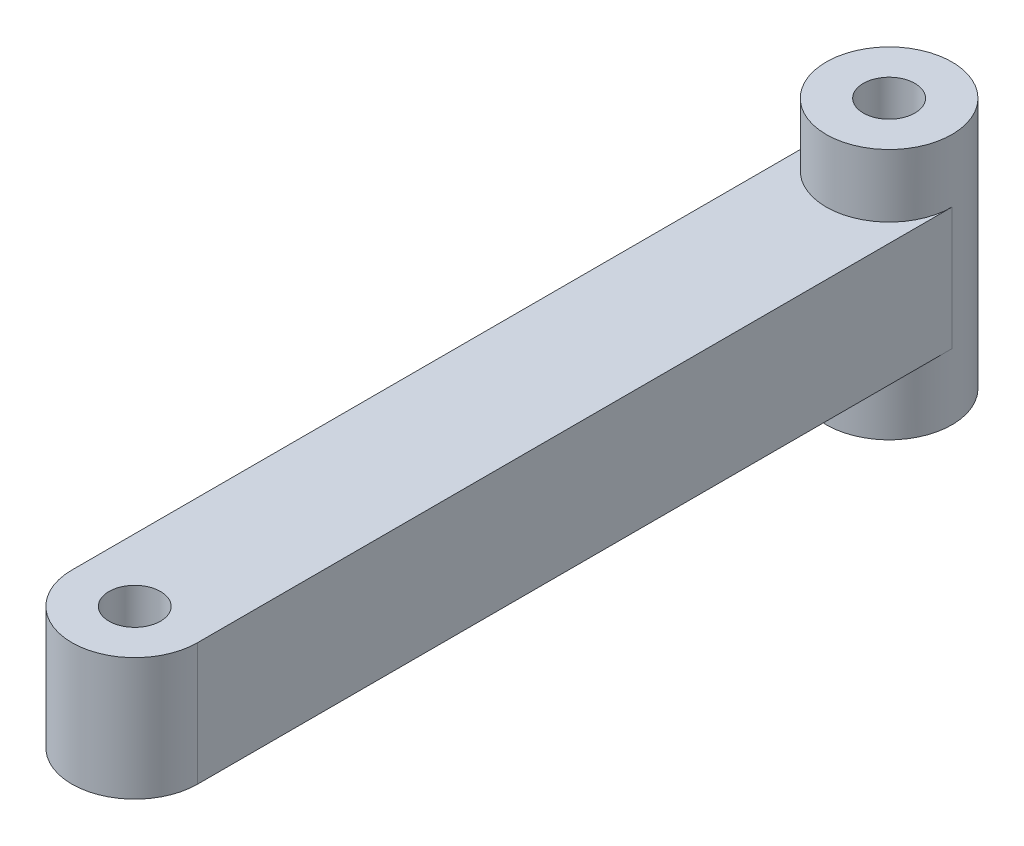
ISO-10303-21;
HEADER;
FILE_DESCRIPTION(('STEP AP214'),'2;1');
FILE_NAME('part.step','',(''),(''),'','','');
FILE_SCHEMA(('AUTOMOTIVE_DESIGN { 1 0 10303 214 1 1 1 1 }'));
ENDSEC;
DATA;
#1=APPLICATION_CONTEXT('core data for automotive mechanical design processes');
#2=APPLICATION_PROTOCOL_DEFINITION('international standard','automotive_design',2000,#1);
#3=PRODUCT_CONTEXT('',#1,'mechanical');
#4=PRODUCT('Part','Part','',(#3));
#5=PRODUCT_RELATED_PRODUCT_CATEGORY('part','',(#4));
#6=PRODUCT_DEFINITION_FORMATION('','',#4);
#7=PRODUCT_DEFINITION_CONTEXT('part definition',#1,'design');
#8=PRODUCT_DEFINITION('design','',#6,#7);
#9=PRODUCT_DEFINITION_SHAPE('','',#8);
#10=(LENGTH_UNIT() NAMED_UNIT(*) SI_UNIT(.MILLI.,.METRE.));
#11=(NAMED_UNIT(*) PLANE_ANGLE_UNIT() SI_UNIT($,.RADIAN.));
#12=(NAMED_UNIT(*) SI_UNIT($,.STERADIAN.) SOLID_ANGLE_UNIT());
#13=UNCERTAINTY_MEASURE_WITH_UNIT(LENGTH_MEASURE(1.E-05),#10,'distance_accuracy_value','');
#14=(GEOMETRIC_REPRESENTATION_CONTEXT(3) GLOBAL_UNCERTAINTY_ASSIGNED_CONTEXT((#13)) GLOBAL_UNIT_ASSIGNED_CONTEXT((#10,
#11,#12)) REPRESENTATION_CONTEXT('',''));
#15=CARTESIAN_POINT('',(0.,0.,0.));
#16=DIRECTION('',(0.,0.,1.));
#17=DIRECTION('',(1.,0.,0.));
#18=AXIS2_PLACEMENT_3D('',#15,#16,#17);
#19=CARTESIAN_POINT('',(0.,9.75,0.));
#20=DIRECTION('',(0.,1.,0.));
#21=DIRECTION('',(0.,0.,1.));
#22=AXIS2_PLACEMENT_3D('',#19,#20,#21);
#23=PLANE('',#22);
#24=CARTESIAN_POINT('',(0.,9.75,-60.));
#25=DIRECTION('',(0.,1.,0.));
#26=DIRECTION('',(0.,0.,1.));
#27=AXIS2_PLACEMENT_3D('',#24,#25,#26);
#28=CIRCLE('',#27,5.);
#29=CARTESIAN_POINT('',(-5.,9.75,-60.));
#30=VERTEX_POINT('',#29);
#31=CARTESIAN_POINT('',(5.,9.75,-60.));
#32=VERTEX_POINT('',#31);
#33=EDGE_CURVE('E94',#30,#32,#28,.T.);
#34=ORIENTED_EDGE('',*,*,#33,.F.);
#35=DIRECTION('',(0.,0.,1.));
#36=VECTOR('',#35,1.);
#37=CARTESIAN_POINT('',(-5.,9.75,0.));
#38=LINE('',#37,#36);
#39=CARTESIAN_POINT('',(-5.,9.75,0.));
#40=VERTEX_POINT('',#39);
#41=EDGE_CURVE('E57',#30,#40,#38,.T.);
#42=ORIENTED_EDGE('',*,*,#41,.T.);
#43=CARTESIAN_POINT('',(0.,9.75,0.));
#44=DIRECTION('',(0.,1.,0.));
#45=DIRECTION('',(0.,0.,1.));
#46=AXIS2_PLACEMENT_3D('',#43,#44,#45);
#47=CIRCLE('',#46,5.);
#48=CARTESIAN_POINT('',(5.,9.75,0.));
#49=VERTEX_POINT('',#48);
#50=EDGE_CURVE('E107',#40,#49,#47,.T.);
#51=ORIENTED_EDGE('',*,*,#50,.T.);
#52=DIRECTION('',(0.,0.,-1.));
#53=VECTOR('',#52,1.);
#54=CARTESIAN_POINT('',(5.,9.75,0.));
#55=LINE('',#54,#53);
#56=EDGE_CURVE('E82',#49,#32,#55,.T.);
#57=ORIENTED_EDGE('',*,*,#56,.T.);
#58=EDGE_LOOP('',(#34,#42,#51,#57));
#59=FACE_BOUND('',#58,.T.);
#60=CARTESIAN_POINT('',(0.,9.75,0.));
#61=DIRECTION('',(0.,1.,0.));
#62=DIRECTION('',(0.,0.,1.));
#63=AXIS2_PLACEMENT_3D('',#60,#61,#62);
#64=CIRCLE('',#63,2.05);
#65=CARTESIAN_POINT('',(0.,9.75,2.05));
#66=VERTEX_POINT('',#65);
#67=EDGE_CURVE('E124',#66,#66,#64,.T.);
#68=ORIENTED_EDGE('',*,*,#67,.F.);
#69=EDGE_LOOP('',(#68));
#70=FACE_BOUND('',#69,.T.);
#71=ADVANCED_FACE('F39',(#59,#70),#23,.T.);
#72=CARTESIAN_POINT('',(0.,0.,0.));
#73=DIRECTION('',(0.,1.,0.));
#74=DIRECTION('',(0.,0.,1.));
#75=AXIS2_PLACEMENT_3D('',#72,#73,#74);
#76=PLANE('',#75);
#77=DIRECTION('',(0.,0.,1.));
#78=VECTOR('',#77,1.);
#79=CARTESIAN_POINT('',(-5.,0.,0.));
#80=LINE('',#79,#78);
#81=CARTESIAN_POINT('',(-5.,0.,-60.));
#82=VERTEX_POINT('',#81);
#83=CARTESIAN_POINT('',(-5.,0.,0.));
#84=VERTEX_POINT('',#83);
#85=EDGE_CURVE('E76',#82,#84,#80,.T.);
#86=ORIENTED_EDGE('',*,*,#85,.F.);
#87=CARTESIAN_POINT('',(0.,0.,-60.));
#88=DIRECTION('',(0.,1.,0.));
#89=DIRECTION('',(0.,0.,1.));
#90=AXIS2_PLACEMENT_3D('',#87,#88,#89);
#91=CIRCLE('',#90,5.);
#92=CARTESIAN_POINT('',(5.,0.,-60.));
#93=VERTEX_POINT('',#92);
#94=EDGE_CURVE('E71',#82,#93,#91,.T.);
#95=ORIENTED_EDGE('',*,*,#94,.T.);
#96=DIRECTION('',(0.,0.,-1.));
#97=VECTOR('',#96,1.);
#98=CARTESIAN_POINT('',(5.,0.,0.));
#99=LINE('',#98,#97);
#100=CARTESIAN_POINT('',(5.,0.,0.));
#101=VERTEX_POINT('',#100);
#102=EDGE_CURVE('E108',#101,#93,#99,.T.);
#103=ORIENTED_EDGE('',*,*,#102,.F.);
#104=CARTESIAN_POINT('',(0.,0.,0.));
#105=DIRECTION('',(0.,1.,0.));
#106=DIRECTION('',(0.,0.,1.));
#107=AXIS2_PLACEMENT_3D('',#104,#105,#106);
#108=CIRCLE('',#107,5.);
#109=EDGE_CURVE('E105',#84,#101,#108,.T.);
#110=ORIENTED_EDGE('',*,*,#109,.F.);
#111=EDGE_LOOP('',(#86,#95,#103,#110));
#112=FACE_BOUND('',#111,.T.);
#113=CARTESIAN_POINT('',(0.,0.,0.));
#114=DIRECTION('',(0.,1.,0.));
#115=DIRECTION('',(0.,0.,1.));
#116=AXIS2_PLACEMENT_3D('',#113,#114,#115);
#117=CIRCLE('',#116,2.05);
#118=CARTESIAN_POINT('',(0.,0.,2.05));
#119=VERTEX_POINT('',#118);
#120=EDGE_CURVE('E129',#119,#119,#117,.T.);
#121=ORIENTED_EDGE('',*,*,#120,.T.);
#122=EDGE_LOOP('',(#121));
#123=FACE_BOUND('',#122,.T.);
#124=ADVANCED_FACE('F102',(#112,#123),#76,.F.);
#125=CARTESIAN_POINT('',(0.,9.75,0.));
#126=DIRECTION('',(0.,-1.,0.));
#127=DIRECTION('',(0.,0.,-1.));
#128=AXIS2_PLACEMENT_3D('',#125,#126,#127);
#129=CYLINDRICAL_SURFACE('',#128,5.);
#130=ORIENTED_EDGE('',*,*,#109,.T.);
#131=DIRECTION('',(0.,-1.,0.));
#132=VECTOR('',#131,1.);
#133=CARTESIAN_POINT('',(5.,9.75,0.));
#134=LINE('',#133,#132);
#135=EDGE_CURVE('E11',#49,#101,#134,.T.);
#136=ORIENTED_EDGE('',*,*,#135,.F.);
#137=ORIENTED_EDGE('',*,*,#50,.F.);
#138=DIRECTION('',(0.,-1.,0.));
#139=VECTOR('',#138,1.);
#140=CARTESIAN_POINT('',(-5.,9.75,0.));
#141=LINE('',#140,#139);
#142=EDGE_CURVE('E99',#40,#84,#141,.T.);
#143=ORIENTED_EDGE('',*,*,#142,.T.);
#144=EDGE_LOOP('',(#130,#136,#137,#143));
#145=FACE_BOUND('',#144,.T.);
#146=ADVANCED_FACE('F41',(#145),#129,.T.);
#147=CARTESIAN_POINT('',(5.,9.75,0.));
#148=DIRECTION('',(-1.,0.,0.));
#149=DIRECTION('',(0.,0.,1.));
#150=AXIS2_PLACEMENT_3D('',#147,#148,#149);
#151=PLANE('',#150);
#152=ORIENTED_EDGE('',*,*,#102,.T.);
#153=DIRECTION('',(0.,-1.,0.));
#154=VECTOR('',#153,1.);
#155=CARTESIAN_POINT('',(5.,9.75,-60.));
#156=LINE('',#155,#154);
#157=EDGE_CURVE('E49',#32,#93,#156,.T.);
#158=ORIENTED_EDGE('',*,*,#157,.F.);
#159=ORIENTED_EDGE('',*,*,#56,.F.);
#160=ORIENTED_EDGE('',*,*,#135,.T.);
#161=EDGE_LOOP('',(#152,#158,#159,#160));
#162=FACE_BOUND('',#161,.T.);
#163=ADVANCED_FACE('F181',(#162),#151,.F.);
#164=CARTESIAN_POINT('',(0.,9.75,-60.));
#165=DIRECTION('',(0.,-1.,0.));
#166=DIRECTION('',(0.,0.,-1.));
#167=AXIS2_PLACEMENT_3D('',#164,#165,#166);
#168=CYLINDRICAL_SURFACE('',#167,5.);
#169=ORIENTED_EDGE('',*,*,#157,.T.);
#170=ORIENTED_EDGE('',*,*,#94,.F.);
#171=DIRECTION('',(0.,-1.,0.));
#172=VECTOR('',#171,1.);
#173=CARTESIAN_POINT('',(-5.,9.75,-60.));
#174=LINE('',#173,#172);
#175=EDGE_CURVE('E92',#30,#82,#174,.T.);
#176=ORIENTED_EDGE('',*,*,#175,.F.);
#177=ORIENTED_EDGE('',*,*,#33,.T.);
#178=EDGE_LOOP('',(#169,#170,#176,#177));
#179=FACE_BOUND('',#178,.T.);
#180=CARTESIAN_POINT('',(0.,-5.25,-60.));
#181=DIRECTION('',(0.,1.,0.));
#182=DIRECTION('',(0.,0.,1.));
#183=AXIS2_PLACEMENT_3D('',#180,#181,#182);
#184=CIRCLE('',#183,5.);
#185=CARTESIAN_POINT('',(0.,-5.25,-55.));
#186=VERTEX_POINT('',#185);
#187=EDGE_CURVE('E95',#186,#186,#184,.T.);
#188=ORIENTED_EDGE('',*,*,#187,.T.);
#189=EDGE_LOOP('',(#188));
#190=FACE_BOUND('',#189,.T.);
#191=CARTESIAN_POINT('',(0.,14.75,-60.));
#192=DIRECTION('',(0.,1.,0.));
#193=DIRECTION('',(0.,0.,1.));
#194=AXIS2_PLACEMENT_3D('',#191,#192,#193);
#195=CIRCLE('',#194,5.);
#196=CARTESIAN_POINT('',(0.,14.75,-55.));
#197=VERTEX_POINT('',#196);
#198=EDGE_CURVE('E145',#197,#197,#195,.T.);
#199=ORIENTED_EDGE('',*,*,#198,.F.);
#200=EDGE_LOOP('',(#199));
#201=FACE_BOUND('',#200,.T.);
#202=ADVANCED_FACE('F89',(#179,#190,#201),#168,.T.);
#203=CARTESIAN_POINT('',(-5.,9.75,0.));
#204=DIRECTION('',(1.,0.,0.));
#205=DIRECTION('',(0.,0.,-1.));
#206=AXIS2_PLACEMENT_3D('',#203,#204,#205);
#207=PLANE('',#206);
#208=ORIENTED_EDGE('',*,*,#85,.T.);
#209=ORIENTED_EDGE('',*,*,#142,.F.);
#210=ORIENTED_EDGE('',*,*,#41,.F.);
#211=ORIENTED_EDGE('',*,*,#175,.T.);
#212=EDGE_LOOP('',(#208,#209,#210,#211));
#213=FACE_BOUND('',#212,.T.);
#214=ADVANCED_FACE('F97',(#213),#207,.F.);
#215=CARTESIAN_POINT('',(0.,9.75,0.));
#216=DIRECTION('',(0.,-1.,0.));
#217=DIRECTION('',(0.,0.,-1.));
#218=AXIS2_PLACEMENT_3D('',#215,#216,#217);
#219=CYLINDRICAL_SURFACE('',#218,2.05);
#220=ORIENTED_EDGE('',*,*,#67,.T.);
#221=EDGE_LOOP('',(#220));
#222=FACE_BOUND('',#221,.T.);
#223=ORIENTED_EDGE('',*,*,#120,.F.);
#224=EDGE_LOOP('',(#223));
#225=FACE_BOUND('',#224,.T.);
#226=ADVANCED_FACE('F179',(#222,#225),#219,.F.);
#227=CARTESIAN_POINT('',(0.,-5.25,-60.));
#228=DIRECTION('',(0.,1.,0.));
#229=DIRECTION('',(0.,0.,1.));
#230=AXIS2_PLACEMENT_3D('',#227,#228,#229);
#231=PLANE('',#230);
#232=CARTESIAN_POINT('',(0.,-5.25,-60.));
#233=DIRECTION('',(0.,1.,0.));
#234=DIRECTION('',(0.,0.,1.));
#235=AXIS2_PLACEMENT_3D('',#232,#233,#234);
#236=CIRCLE('',#235,2.05000000000001);
#237=CARTESIAN_POINT('',(0.,-5.25,-57.95));
#238=VERTEX_POINT('',#237);
#239=EDGE_CURVE('E141',#238,#238,#236,.T.);
#240=ORIENTED_EDGE('',*,*,#239,.T.);
#241=EDGE_LOOP('',(#240));
#242=FACE_BOUND('',#241,.T.);
#243=ORIENTED_EDGE('',*,*,#187,.F.);
#244=EDGE_LOOP('',(#243));
#245=FACE_BOUND('',#244,.T.);
#246=ADVANCED_FACE('F163',(#242,#245),#231,.F.);
#247=CARTESIAN_POINT('',(0.,9.75,-60.));
#248=DIRECTION('',(0.,-1.,0.));
#249=DIRECTION('',(0.,0.,-1.));
#250=AXIS2_PLACEMENT_3D('',#247,#248,#249);
#251=CYLINDRICAL_SURFACE('',#250,2.05);
#252=ORIENTED_EDGE('',*,*,#239,.F.);
#253=EDGE_LOOP('',(#252));
#254=FACE_BOUND('',#253,.T.);
#255=CARTESIAN_POINT('',(0.,14.75,-60.));
#256=DIRECTION('',(0.,1.,0.));
#257=DIRECTION('',(0.,0.,1.));
#258=AXIS2_PLACEMENT_3D('',#255,#256,#257);
#259=CIRCLE('',#258,2.05000000000001);
#260=CARTESIAN_POINT('',(0.,14.75,-57.95));
#261=VERTEX_POINT('',#260);
#262=EDGE_CURVE('E149',#261,#261,#259,.T.);
#263=ORIENTED_EDGE('',*,*,#262,.T.);
#264=EDGE_LOOP('',(#263));
#265=FACE_BOUND('',#264,.T.);
#266=ADVANCED_FACE('F154',(#254,#265),#251,.F.);
#267=CARTESIAN_POINT('',(0.,14.75,-60.));
#268=DIRECTION('',(0.,1.,0.));
#269=DIRECTION('',(0.,0.,1.));
#270=AXIS2_PLACEMENT_3D('',#267,#268,#269);
#271=PLANE('',#270);
#272=ORIENTED_EDGE('',*,*,#198,.T.);
#273=EDGE_LOOP('',(#272));
#274=FACE_BOUND('',#273,.T.);
#275=ORIENTED_EDGE('',*,*,#262,.F.);
#276=EDGE_LOOP('',(#275));
#277=FACE_BOUND('',#276,.T.);
#278=ADVANCED_FACE('F156',(#274,#277),#271,.T.);
#279=CLOSED_SHELL('',(#71,#124,#146,#163,#202,#214,#226,#246,#266,#278));
#280=MANIFOLD_SOLID_BREP('B2',#279);
#281=ADVANCED_BREP_SHAPE_REPRESENTATION('',(#18,#280),#14);
#282=SHAPE_DEFINITION_REPRESENTATION(#9,#281);
ENDSEC;
END-ISO-10303-21;
